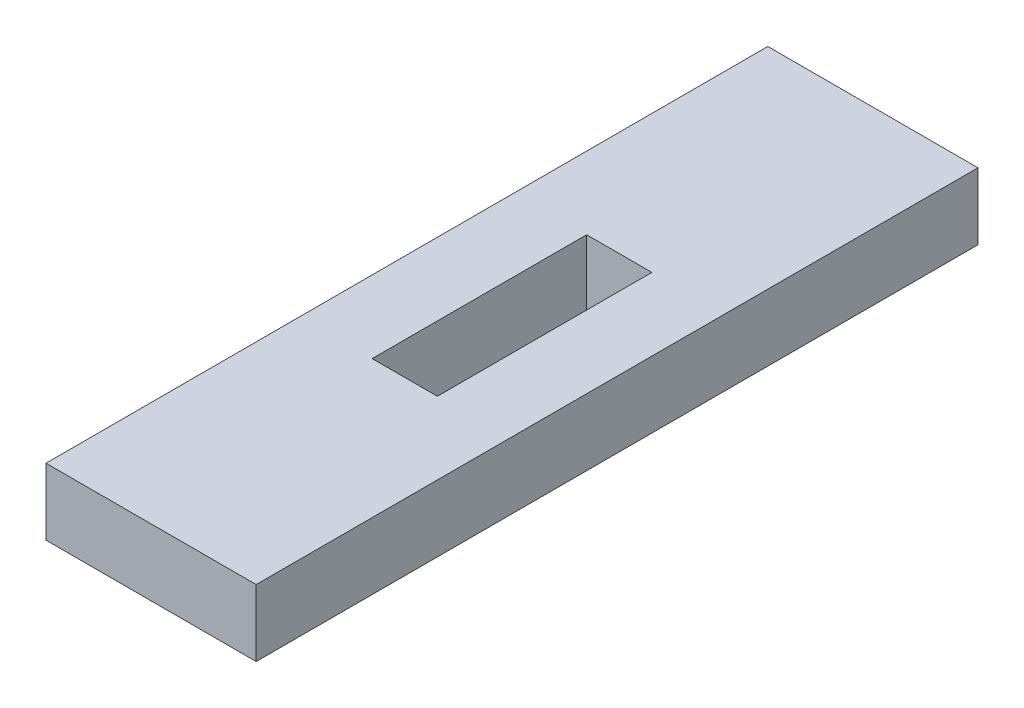
ISO-10303-21;
HEADER;
FILE_DESCRIPTION(('STEP AP214'),'2;1');
FILE_NAME('part.step','',(''),(''),'','','');
FILE_SCHEMA(('AUTOMOTIVE_DESIGN { 1 0 10303 214 1 1 1 1 }'));
ENDSEC;
DATA;
#1=APPLICATION_CONTEXT('core data for automotive mechanical design processes');
#2=APPLICATION_PROTOCOL_DEFINITION('international standard','automotive_design',2000,#1);
#3=PRODUCT_CONTEXT('',#1,'mechanical');
#4=PRODUCT('Part','Part','',(#3));
#5=PRODUCT_RELATED_PRODUCT_CATEGORY('part','',(#4));
#6=PRODUCT_DEFINITION_FORMATION('','',#4);
#7=PRODUCT_DEFINITION_CONTEXT('part definition',#1,'design');
#8=PRODUCT_DEFINITION('design','',#6,#7);
#9=PRODUCT_DEFINITION_SHAPE('','',#8);
#10=(LENGTH_UNIT() NAMED_UNIT(*) SI_UNIT(.MILLI.,.METRE.));
#11=(NAMED_UNIT(*) PLANE_ANGLE_UNIT() SI_UNIT($,.RADIAN.));
#12=(NAMED_UNIT(*) SI_UNIT($,.STERADIAN.) SOLID_ANGLE_UNIT());
#13=UNCERTAINTY_MEASURE_WITH_UNIT(LENGTH_MEASURE(1.E-05),#10,'distance_accuracy_value','');
#14=(GEOMETRIC_REPRESENTATION_CONTEXT(3) GLOBAL_UNCERTAINTY_ASSIGNED_CONTEXT((#13)) GLOBAL_UNIT_ASSIGNED_CONTEXT((#10,
#11,#12)) REPRESENTATION_CONTEXT('',''));
#15=CARTESIAN_POINT('',(0.,0.,0.));
#16=DIRECTION('',(0.,0.,1.));
#17=DIRECTION('',(1.,0.,0.));
#18=AXIS2_PLACEMENT_3D('',#15,#16,#17);
#19=CARTESIAN_POINT('',(0.,11.684,0.));
#20=DIRECTION('',(0.,1.,0.));
#21=DIRECTION('',(0.,0.,1.));
#22=AXIS2_PLACEMENT_3D('',#19,#20,#21);
#23=PLANE('',#22);
#24=DIRECTION('',(0.,0.,1.));
#25=VECTOR('',#24,1.);
#26=CARTESIAN_POINT('',(-18.415,11.684,63.246));
#27=LINE('',#26,#25);
#28=CARTESIAN_POINT('',(-18.415,11.684,-63.246));
#29=VERTEX_POINT('',#28);
#30=CARTESIAN_POINT('',(-18.415,11.684,63.246));
#31=VERTEX_POINT('',#30);
#32=EDGE_CURVE('E134',#29,#31,#27,.T.);
#33=ORIENTED_EDGE('',*,*,#32,.T.);
#34=DIRECTION('',(1.,0.,0.));
#35=VECTOR('',#34,1.);
#36=CARTESIAN_POINT('',(18.415,11.684,63.246));
#37=LINE('',#36,#35);
#38=CARTESIAN_POINT('',(18.415,11.684,63.246));
#39=VERTEX_POINT('',#38);
#40=EDGE_CURVE('E137',#31,#39,#37,.T.);
#41=ORIENTED_EDGE('',*,*,#40,.T.);
#42=DIRECTION('',(0.,0.,-1.));
#43=VECTOR('',#42,1.);
#44=CARTESIAN_POINT('',(18.415,11.684,63.246));
#45=LINE('',#44,#43);
#46=CARTESIAN_POINT('',(18.415,11.684,-63.246));
#47=VERTEX_POINT('',#46);
#48=EDGE_CURVE('E140',#39,#47,#45,.T.);
#49=ORIENTED_EDGE('',*,*,#48,.T.);
#50=DIRECTION('',(-1.,0.,0.));
#51=VECTOR('',#50,1.);
#52=CARTESIAN_POINT('',(18.415,11.684,-63.246));
#53=LINE('',#52,#51);
#54=EDGE_CURVE('E142',#47,#29,#53,.T.);
#55=ORIENTED_EDGE('',*,*,#54,.T.);
#56=EDGE_LOOP('',(#33,#41,#49,#55));
#57=FACE_BOUND('',#56,.T.);
#58=DIRECTION('',(1.,0.,0.));
#59=VECTOR('',#58,1.);
#60=CARTESIAN_POINT('',(5.71499999999999,11.684,18.796));
#61=LINE('',#60,#59);
#62=CARTESIAN_POINT('',(-5.71500000000001,11.684,18.796));
#63=VERTEX_POINT('',#62);
#64=CARTESIAN_POINT('',(5.71499999999999,11.684,18.796));
#65=VERTEX_POINT('',#64);
#66=EDGE_CURVE('E106',#63,#65,#61,.T.);
#67=ORIENTED_EDGE('',*,*,#66,.F.);
#68=DIRECTION('',(0.,0.,1.));
#69=VECTOR('',#68,1.);
#70=CARTESIAN_POINT('',(-5.71500000000001,11.684,18.796));
#71=LINE('',#70,#69);
#72=CARTESIAN_POINT('',(-5.71500000000001,11.684,-18.796));
#73=VERTEX_POINT('',#72);
#74=EDGE_CURVE('E98',#73,#63,#71,.T.);
#75=ORIENTED_EDGE('',*,*,#74,.F.);
#76=DIRECTION('',(-1.,0.,0.));
#77=VECTOR('',#76,1.);
#78=CARTESIAN_POINT('',(5.71499999999999,11.684,-18.796));
#79=LINE('',#78,#77);
#80=CARTESIAN_POINT('',(5.71499999999999,11.684,-18.796));
#81=VERTEX_POINT('',#80);
#82=EDGE_CURVE('E120',#81,#73,#79,.T.);
#83=ORIENTED_EDGE('',*,*,#82,.F.);
#84=DIRECTION('',(0.,0.,-1.));
#85=VECTOR('',#84,1.);
#86=CARTESIAN_POINT('',(5.71499999999999,11.684,18.796));
#87=LINE('',#86,#85);
#88=EDGE_CURVE('E118',#65,#81,#87,.T.);
#89=ORIENTED_EDGE('',*,*,#88,.F.);
#90=EDGE_LOOP('',(#67,#75,#83,#89));
#91=FACE_BOUND('',#90,.T.);
#92=ADVANCED_FACE('F33',(#57,#91),#23,.T.);
#93=CARTESIAN_POINT('',(0.,0.,0.));
#94=DIRECTION('',(0.,1.,0.));
#95=DIRECTION('',(0.,0.,1.));
#96=AXIS2_PLACEMENT_3D('',#93,#94,#95);
#97=PLANE('',#96);
#98=DIRECTION('',(0.,0.,1.));
#99=VECTOR('',#98,1.);
#100=CARTESIAN_POINT('',(-18.415,0.,63.246));
#101=LINE('',#100,#99);
#102=CARTESIAN_POINT('',(-18.415,0.,-63.246));
#103=VERTEX_POINT('',#102);
#104=CARTESIAN_POINT('',(-18.415,0.,63.246));
#105=VERTEX_POINT('',#104);
#106=EDGE_CURVE('E114',#103,#105,#101,.T.);
#107=ORIENTED_EDGE('',*,*,#106,.F.);
#108=DIRECTION('',(-1.,0.,0.));
#109=VECTOR('',#108,1.);
#110=CARTESIAN_POINT('',(18.415,0.,-63.246));
#111=LINE('',#110,#109);
#112=CARTESIAN_POINT('',(18.415,0.,-63.246));
#113=VERTEX_POINT('',#112);
#114=EDGE_CURVE('E138',#113,#103,#111,.T.);
#115=ORIENTED_EDGE('',*,*,#114,.F.);
#116=DIRECTION('',(0.,0.,-1.));
#117=VECTOR('',#116,1.);
#118=CARTESIAN_POINT('',(18.415,0.,63.246));
#119=LINE('',#118,#117);
#120=CARTESIAN_POINT('',(18.415,0.,63.246));
#121=VERTEX_POINT('',#120);
#122=EDGE_CURVE('E149',#121,#113,#119,.T.);
#123=ORIENTED_EDGE('',*,*,#122,.F.);
#124=DIRECTION('',(1.,0.,0.));
#125=VECTOR('',#124,1.);
#126=CARTESIAN_POINT('',(18.415,0.,63.246));
#127=LINE('',#126,#125);
#128=EDGE_CURVE('E147',#105,#121,#127,.T.);
#129=ORIENTED_EDGE('',*,*,#128,.F.);
#130=EDGE_LOOP('',(#107,#115,#123,#129));
#131=FACE_BOUND('',#130,.T.);
#132=DIRECTION('',(0.,0.,1.));
#133=VECTOR('',#132,1.);
#134=CARTESIAN_POINT('',(-5.71500000000001,0.,18.796));
#135=LINE('',#134,#133);
#136=CARTESIAN_POINT('',(-5.71500000000001,0.,-18.796));
#137=VERTEX_POINT('',#136);
#138=CARTESIAN_POINT('',(-5.71500000000001,0.,18.796));
#139=VERTEX_POINT('',#138);
#140=EDGE_CURVE('E56',#137,#139,#135,.T.);
#141=ORIENTED_EDGE('',*,*,#140,.T.);
#142=DIRECTION('',(1.,0.,0.));
#143=VECTOR('',#142,1.);
#144=CARTESIAN_POINT('',(5.71499999999999,0.,18.796));
#145=LINE('',#144,#143);
#146=CARTESIAN_POINT('',(5.71499999999999,0.,18.796));
#147=VERTEX_POINT('',#146);
#148=EDGE_CURVE('E113',#139,#147,#145,.T.);
#149=ORIENTED_EDGE('',*,*,#148,.T.);
#150=DIRECTION('',(0.,0.,-1.));
#151=VECTOR('',#150,1.);
#152=CARTESIAN_POINT('',(5.71499999999999,0.,18.796));
#153=LINE('',#152,#151);
#154=CARTESIAN_POINT('',(5.71499999999999,0.,-18.796));
#155=VERTEX_POINT('',#154);
#156=EDGE_CURVE('E126',#147,#155,#153,.T.);
#157=ORIENTED_EDGE('',*,*,#156,.T.);
#158=DIRECTION('',(-1.,0.,0.));
#159=VECTOR('',#158,1.);
#160=CARTESIAN_POINT('',(5.71499999999999,0.,-18.796));
#161=LINE('',#160,#159);
#162=EDGE_CURVE('E107',#155,#137,#161,.T.);
#163=ORIENTED_EDGE('',*,*,#162,.T.);
#164=EDGE_LOOP('',(#141,#149,#157,#163));
#165=FACE_BOUND('',#164,.T.);
#166=ADVANCED_FACE('F167',(#131,#165),#97,.F.);
#167=CARTESIAN_POINT('',(-18.415,11.684,63.246));
#168=DIRECTION('',(1.,0.,0.));
#169=DIRECTION('',(0.,0.,-1.));
#170=AXIS2_PLACEMENT_3D('',#167,#168,#169);
#171=PLANE('',#170);
#172=ORIENTED_EDGE('',*,*,#106,.T.);
#173=DIRECTION('',(0.,-1.,0.));
#174=VECTOR('',#173,1.);
#175=CARTESIAN_POINT('',(-18.415,11.684,63.246));
#176=LINE('',#175,#174);
#177=EDGE_CURVE('E11',#31,#105,#176,.T.);
#178=ORIENTED_EDGE('',*,*,#177,.F.);
#179=ORIENTED_EDGE('',*,*,#32,.F.);
#180=DIRECTION('',(0.,-1.,0.));
#181=VECTOR('',#180,1.);
#182=CARTESIAN_POINT('',(-18.415,11.684,-63.246));
#183=LINE('',#182,#181);
#184=EDGE_CURVE('E144',#29,#103,#183,.T.);
#185=ORIENTED_EDGE('',*,*,#184,.T.);
#186=EDGE_LOOP('',(#172,#178,#179,#185));
#187=FACE_BOUND('',#186,.T.);
#188=ADVANCED_FACE('F35',(#187),#171,.F.);
#189=CARTESIAN_POINT('',(18.415,11.684,63.246));
#190=DIRECTION('',(0.,0.,-1.));
#191=DIRECTION('',(-1.,0.,0.));
#192=AXIS2_PLACEMENT_3D('',#189,#190,#191);
#193=PLANE('',#192);
#194=ORIENTED_EDGE('',*,*,#128,.T.);
#195=DIRECTION('',(0.,-1.,0.));
#196=VECTOR('',#195,1.);
#197=CARTESIAN_POINT('',(18.415,11.684,63.246));
#198=LINE('',#197,#196);
#199=EDGE_CURVE('E41',#39,#121,#198,.T.);
#200=ORIENTED_EDGE('',*,*,#199,.F.);
#201=ORIENTED_EDGE('',*,*,#40,.F.);
#202=ORIENTED_EDGE('',*,*,#177,.T.);
#203=EDGE_LOOP('',(#194,#200,#201,#202));
#204=FACE_BOUND('',#203,.T.);
#205=ADVANCED_FACE('F177',(#204),#193,.F.);
#206=CARTESIAN_POINT('',(18.415,11.684,63.246));
#207=DIRECTION('',(-1.,0.,0.));
#208=DIRECTION('',(0.,0.,1.));
#209=AXIS2_PLACEMENT_3D('',#206,#207,#208);
#210=PLANE('',#209);
#211=ORIENTED_EDGE('',*,*,#122,.T.);
#212=DIRECTION('',(0.,-1.,0.));
#213=VECTOR('',#212,1.);
#214=CARTESIAN_POINT('',(18.415,11.684,-63.246));
#215=LINE('',#214,#213);
#216=EDGE_CURVE('E154',#47,#113,#215,.T.);
#217=ORIENTED_EDGE('',*,*,#216,.F.);
#218=ORIENTED_EDGE('',*,*,#48,.F.);
#219=ORIENTED_EDGE('',*,*,#199,.T.);
#220=EDGE_LOOP('',(#211,#217,#218,#219));
#221=FACE_BOUND('',#220,.T.);
#222=ADVANCED_FACE('F161',(#221),#210,.F.);
#223=CARTESIAN_POINT('',(18.415,11.684,-63.246));
#224=DIRECTION('',(0.,0.,1.));
#225=DIRECTION('',(1.,0.,0.));
#226=AXIS2_PLACEMENT_3D('',#223,#224,#225);
#227=PLANE('',#226);
#228=ORIENTED_EDGE('',*,*,#114,.T.);
#229=ORIENTED_EDGE('',*,*,#184,.F.);
#230=ORIENTED_EDGE('',*,*,#54,.F.);
#231=ORIENTED_EDGE('',*,*,#216,.T.);
#232=EDGE_LOOP('',(#228,#229,#230,#231));
#233=FACE_BOUND('',#232,.T.);
#234=ADVANCED_FACE('F171',(#233),#227,.F.);
#235=CARTESIAN_POINT('',(-5.71500000000001,11.684,18.796));
#236=DIRECTION('',(1.,0.,0.));
#237=DIRECTION('',(0.,0.,-1.));
#238=AXIS2_PLACEMENT_3D('',#235,#236,#237);
#239=PLANE('',#238);
#240=ORIENTED_EDGE('',*,*,#140,.F.);
#241=DIRECTION('',(0.,-1.,0.));
#242=VECTOR('',#241,1.);
#243=CARTESIAN_POINT('',(-5.71500000000001,11.684,-18.796));
#244=LINE('',#243,#242);
#245=EDGE_CURVE('E102',#73,#137,#244,.T.);
#246=ORIENTED_EDGE('',*,*,#245,.F.);
#247=ORIENTED_EDGE('',*,*,#74,.T.);
#248=DIRECTION('',(0.,-1.,0.));
#249=VECTOR('',#248,1.);
#250=CARTESIAN_POINT('',(-5.71500000000001,11.684,18.796));
#251=LINE('',#250,#249);
#252=EDGE_CURVE('E101',#63,#139,#251,.T.);
#253=ORIENTED_EDGE('',*,*,#252,.T.);
#254=EDGE_LOOP('',(#240,#246,#247,#253));
#255=FACE_BOUND('',#254,.T.);
#256=ADVANCED_FACE('F100',(#255),#239,.T.);
#257=CARTESIAN_POINT('',(5.71499999999999,11.684,18.796));
#258=DIRECTION('',(0.,0.,-1.));
#259=DIRECTION('',(-1.,0.,0.));
#260=AXIS2_PLACEMENT_3D('',#257,#258,#259);
#261=PLANE('',#260);
#262=ORIENTED_EDGE('',*,*,#148,.F.);
#263=ORIENTED_EDGE('',*,*,#252,.F.);
#264=ORIENTED_EDGE('',*,*,#66,.T.);
#265=DIRECTION('',(0.,-1.,0.));
#266=VECTOR('',#265,1.);
#267=CARTESIAN_POINT('',(5.71499999999999,11.684,18.796));
#268=LINE('',#267,#266);
#269=EDGE_CURVE('E115',#65,#147,#268,.T.);
#270=ORIENTED_EDGE('',*,*,#269,.T.);
#271=EDGE_LOOP('',(#262,#263,#264,#270));
#272=FACE_BOUND('',#271,.T.);
#273=ADVANCED_FACE('F110',(#272),#261,.T.);
#274=CARTESIAN_POINT('',(5.71499999999999,11.684,18.796));
#275=DIRECTION('',(-1.,0.,0.));
#276=DIRECTION('',(0.,0.,1.));
#277=AXIS2_PLACEMENT_3D('',#274,#275,#276);
#278=PLANE('',#277);
#279=ORIENTED_EDGE('',*,*,#156,.F.);
#280=ORIENTED_EDGE('',*,*,#269,.F.);
#281=ORIENTED_EDGE('',*,*,#88,.T.);
#282=DIRECTION('',(0.,-1.,0.));
#283=VECTOR('',#282,1.);
#284=CARTESIAN_POINT('',(5.71499999999999,11.684,-18.796));
#285=LINE('',#284,#283);
#286=EDGE_CURVE('E48',#81,#155,#285,.T.);
#287=ORIENTED_EDGE('',*,*,#286,.T.);
#288=EDGE_LOOP('',(#279,#280,#281,#287));
#289=FACE_BOUND('',#288,.T.);
#290=ADVANCED_FACE('F200',(#289),#278,.T.);
#291=CARTESIAN_POINT('',(5.71499999999999,11.684,-18.796));
#292=DIRECTION('',(0.,0.,1.));
#293=DIRECTION('',(1.,0.,0.));
#294=AXIS2_PLACEMENT_3D('',#291,#292,#293);
#295=PLANE('',#294);
#296=ORIENTED_EDGE('',*,*,#162,.F.);
#297=ORIENTED_EDGE('',*,*,#286,.F.);
#298=ORIENTED_EDGE('',*,*,#82,.T.);
#299=ORIENTED_EDGE('',*,*,#245,.T.);
#300=EDGE_LOOP('',(#296,#297,#298,#299));
#301=FACE_BOUND('',#300,.T.);
#302=ADVANCED_FACE('F204',(#301),#295,.T.);
#303=CLOSED_SHELL('',(#92,#166,#188,#205,#222,#234,#256,#273,#290,#302));
#304=MANIFOLD_SOLID_BREP('B2',#303);
#305=ADVANCED_BREP_SHAPE_REPRESENTATION('',(#18,#304),#14);
#306=SHAPE_DEFINITION_REPRESENTATION(#9,#305);
ENDSEC;
END-ISO-10303-21;
